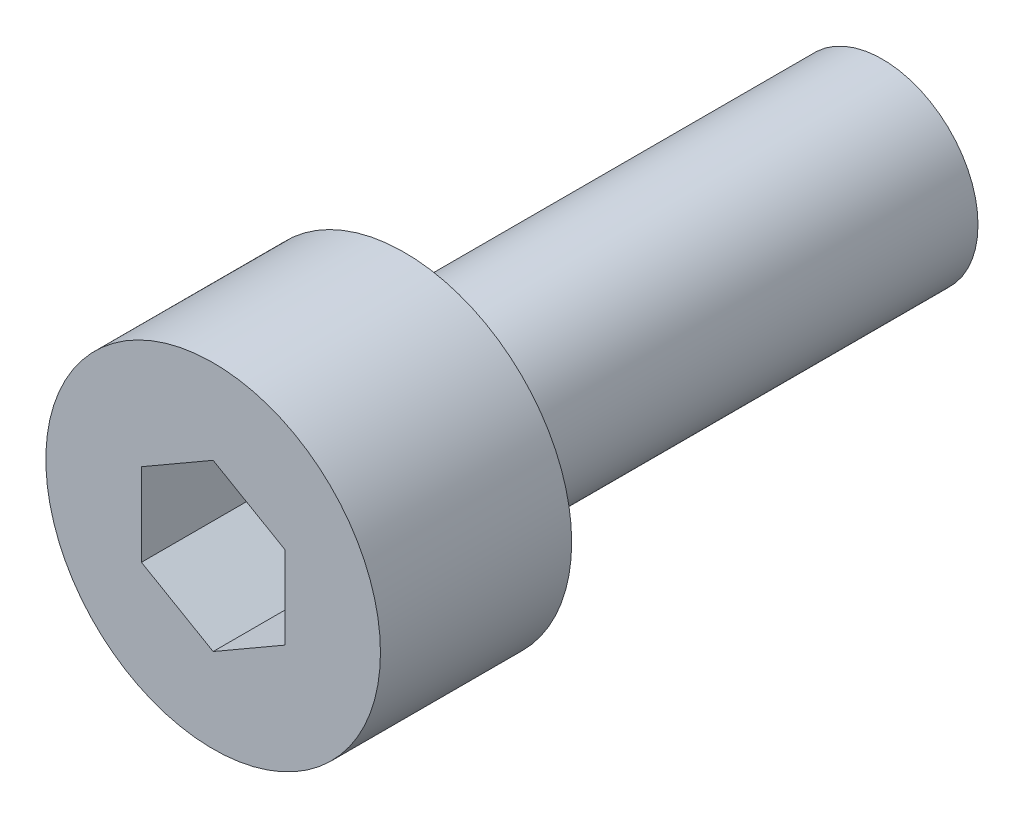
ISO-10303-21;
HEADER;
FILE_DESCRIPTION(('STEP AP214'),'2;1');
FILE_NAME('part.step','',(''),(''),'','','');
FILE_SCHEMA(('AUTOMOTIVE_DESIGN { 1 0 10303 214 1 1 1 1 }'));
ENDSEC;
DATA;
#1=APPLICATION_CONTEXT('core data for automotive mechanical design processes');
#2=APPLICATION_PROTOCOL_DEFINITION('international standard','automotive_design',2000,#1);
#3=PRODUCT_CONTEXT('',#1,'mechanical');
#4=PRODUCT('Part','Part','',(#3));
#5=PRODUCT_RELATED_PRODUCT_CATEGORY('part','',(#4));
#6=PRODUCT_DEFINITION_FORMATION('','',#4);
#7=PRODUCT_DEFINITION_CONTEXT('part definition',#1,'design');
#8=PRODUCT_DEFINITION('design','',#6,#7);
#9=PRODUCT_DEFINITION_SHAPE('','',#8);
#10=(LENGTH_UNIT() NAMED_UNIT(*) SI_UNIT(.MILLI.,.METRE.));
#11=(NAMED_UNIT(*) PLANE_ANGLE_UNIT() SI_UNIT($,.RADIAN.));
#12=(NAMED_UNIT(*) SI_UNIT($,.STERADIAN.) SOLID_ANGLE_UNIT());
#13=UNCERTAINTY_MEASURE_WITH_UNIT(LENGTH_MEASURE(1.E-05),#10,'distance_accuracy_value','');
#14=(GEOMETRIC_REPRESENTATION_CONTEXT(3) GLOBAL_UNCERTAINTY_ASSIGNED_CONTEXT((#13)) GLOBAL_UNIT_ASSIGNED_CONTEXT((#10,
#11,#12)) REPRESENTATION_CONTEXT('',''));
#15=CARTESIAN_POINT('',(0.,0.,0.));
#16=DIRECTION('',(0.,0.,1.));
#17=DIRECTION('',(1.,0.,0.));
#18=AXIS2_PLACEMENT_3D('',#15,#16,#17);
#19=CARTESIAN_POINT('',(0.,0.,0.));
#20=DIRECTION('',(0.,0.,-1.));
#21=DIRECTION('',(-1.,0.,0.));
#22=AXIS2_PLACEMENT_3D('',#19,#20,#21);
#23=CYLINDRICAL_SURFACE('',#22,2.);
#24=CARTESIAN_POINT('',(0.,0.,0.));
#25=DIRECTION('',(0.,0.,1.));
#26=DIRECTION('',(1.,0.,0.));
#27=AXIS2_PLACEMENT_3D('',#24,#25,#26);
#28=CIRCLE('',#27,2.);
#29=CARTESIAN_POINT('',(2.,0.,0.));
#30=VERTEX_POINT('',#29);
#31=EDGE_CURVE('E11',#30,#30,#28,.T.);
#32=ORIENTED_EDGE('',*,*,#31,.F.);
#33=EDGE_LOOP('',(#32));
#34=FACE_BOUND('',#33,.T.);
#35=CARTESIAN_POINT('',(0.,0.,-10.));
#36=DIRECTION('',(0.,0.,1.));
#37=DIRECTION('',(1.,0.,0.));
#38=AXIS2_PLACEMENT_3D('',#35,#36,#37);
#39=CIRCLE('',#38,2.);
#40=CARTESIAN_POINT('',(2.,0.,-10.));
#41=VERTEX_POINT('',#40);
#42=EDGE_CURVE('E46',#41,#41,#39,.T.);
#43=ORIENTED_EDGE('',*,*,#42,.T.);
#44=EDGE_LOOP('',(#43));
#45=FACE_BOUND('',#44,.T.);
#46=ADVANCED_FACE('F43',(#34,#45),#23,.T.);
#47=CARTESIAN_POINT('',(0.,0.,-10.));
#48=DIRECTION('',(0.,0.,1.));
#49=DIRECTION('',(1.,0.,0.));
#50=AXIS2_PLACEMENT_3D('',#47,#48,#49);
#51=PLANE('',#50);
#52=ORIENTED_EDGE('',*,*,#42,.F.);
#53=EDGE_LOOP('',(#52));
#54=FACE_BOUND('',#53,.T.);
#55=ADVANCED_FACE('F164',(#54),#51,.F.);
#56=CARTESIAN_POINT('',(0.,0.,4.));
#57=DIRECTION('',(0.,0.,1.));
#58=DIRECTION('',(1.,0.,0.));
#59=AXIS2_PLACEMENT_3D('',#56,#57,#58);
#60=PLANE('',#59);
#61=CARTESIAN_POINT('',(0.,0.,4.));
#62=DIRECTION('',(0.,0.,1.));
#63=DIRECTION('',(1.,0.,0.));
#64=AXIS2_PLACEMENT_3D('',#61,#62,#63);
#65=CIRCLE('',#64,3.5);
#66=CARTESIAN_POINT('',(3.5,0.,4.));
#67=VERTEX_POINT('',#66);
#68=EDGE_CURVE('E146',#67,#67,#65,.T.);
#69=ORIENTED_EDGE('',*,*,#68,.T.);
#70=EDGE_LOOP('',(#69));
#71=FACE_BOUND('',#70,.T.);
#72=DIRECTION('',(-0.866025403784439,0.5,0.));
#73=VECTOR('',#72,1.);
#74=CARTESIAN_POINT('',(1.5,0.866025403784439,4.));
#75=LINE('',#74,#73);
#76=CARTESIAN_POINT('',(1.5,0.866025403784439,4.));
#77=VERTEX_POINT('',#76);
#78=CARTESIAN_POINT('',(0.,1.73205080756888,4.));
#79=VERTEX_POINT('',#78);
#80=EDGE_CURVE('E103',#77,#79,#75,.T.);
#81=ORIENTED_EDGE('',*,*,#80,.F.);
#82=DIRECTION('',(0.,1.,0.));
#83=VECTOR('',#82,1.);
#84=CARTESIAN_POINT('',(1.5,-0.866025403784439,4.));
#85=LINE('',#84,#83);
#86=CARTESIAN_POINT('',(1.5,-0.866025403784439,4.));
#87=VERTEX_POINT('',#86);
#88=EDGE_CURVE('E94',#87,#77,#85,.T.);
#89=ORIENTED_EDGE('',*,*,#88,.F.);
#90=DIRECTION('',(0.866025403784439,0.5,0.));
#91=VECTOR('',#90,1.);
#92=CARTESIAN_POINT('',(0.,-1.73205080756888,4.));
#93=LINE('',#92,#91);
#94=CARTESIAN_POINT('',(0.,-1.73205080756888,4.));
#95=VERTEX_POINT('',#94);
#96=EDGE_CURVE('E124',#95,#87,#93,.T.);
#97=ORIENTED_EDGE('',*,*,#96,.F.);
#98=DIRECTION('',(0.866025403784439,-0.5,0.));
#99=VECTOR('',#98,1.);
#100=CARTESIAN_POINT('',(-1.5,-0.866025403784439,4.));
#101=LINE('',#100,#99);
#102=CARTESIAN_POINT('',(-1.5,-0.866025403784439,4.));
#103=VERTEX_POINT('',#102);
#104=EDGE_CURVE('E121',#103,#95,#101,.T.);
#105=ORIENTED_EDGE('',*,*,#104,.F.);
#106=DIRECTION('',(0.,-1.,0.));
#107=VECTOR('',#106,1.);
#108=CARTESIAN_POINT('',(-1.5,0.866025403784439,4.));
#109=LINE('',#108,#107);
#110=CARTESIAN_POINT('',(-1.5,0.866025403784439,4.));
#111=VERTEX_POINT('',#110);
#112=EDGE_CURVE('E117',#111,#103,#109,.T.);
#113=ORIENTED_EDGE('',*,*,#112,.F.);
#114=DIRECTION('',(-0.866025403784439,-0.5,0.));
#115=VECTOR('',#114,1.);
#116=CARTESIAN_POINT('',(0.,1.73205080756888,4.));
#117=LINE('',#116,#115);
#118=EDGE_CURVE('E115',#79,#111,#117,.T.);
#119=ORIENTED_EDGE('',*,*,#118,.F.);
#120=EDGE_LOOP('',(#81,#89,#97,#105,#113,#119));
#121=FACE_BOUND('',#120,.T.);
#122=ADVANCED_FACE('F113',(#71,#121),#60,.T.);
#123=CARTESIAN_POINT('',(0.,0.,0.));
#124=DIRECTION('',(0.,0.,1.));
#125=DIRECTION('',(1.,0.,0.));
#126=AXIS2_PLACEMENT_3D('',#123,#124,#125);
#127=PLANE('',#126);
#128=ORIENTED_EDGE('',*,*,#31,.T.);
#129=EDGE_LOOP('',(#128));
#130=FACE_BOUND('',#129,.T.);
#131=CARTESIAN_POINT('',(0.,0.,0.));
#132=DIRECTION('',(0.,0.,1.));
#133=DIRECTION('',(1.,0.,0.));
#134=AXIS2_PLACEMENT_3D('',#131,#132,#133);
#135=CIRCLE('',#134,3.5);
#136=CARTESIAN_POINT('',(3.5,0.,0.));
#137=VERTEX_POINT('',#136);
#138=EDGE_CURVE('E109',#137,#137,#135,.T.);
#139=ORIENTED_EDGE('',*,*,#138,.F.);
#140=EDGE_LOOP('',(#139));
#141=FACE_BOUND('',#140,.T.);
#142=ADVANCED_FACE('F154',(#130,#141),#127,.F.);
#143=CARTESIAN_POINT('',(0.,0.,4.));
#144=DIRECTION('',(0.,0.,-1.));
#145=DIRECTION('',(-1.,0.,0.));
#146=AXIS2_PLACEMENT_3D('',#143,#144,#145);
#147=CYLINDRICAL_SURFACE('',#146,3.5);
#148=ORIENTED_EDGE('',*,*,#68,.F.);
#149=EDGE_LOOP('',(#148));
#150=FACE_BOUND('',#149,.T.);
#151=ORIENTED_EDGE('',*,*,#138,.T.);
#152=EDGE_LOOP('',(#151));
#153=FACE_BOUND('',#152,.T.);
#154=ADVANCED_FACE('F152',(#150,#153),#147,.T.);
#155=CARTESIAN_POINT('',(1.5,-0.866025403784439,4.));
#156=DIRECTION('',(-1.,0.,0.));
#157=DIRECTION('',(0.,-1.,0.));
#158=AXIS2_PLACEMENT_3D('',#155,#156,#157);
#159=PLANE('',#158);
#160=DIRECTION('',(0.,1.,0.));
#161=VECTOR('',#160,1.);
#162=CARTESIAN_POINT('',(1.5,-0.866025403784439,0.));
#163=LINE('',#162,#161);
#164=CARTESIAN_POINT('',(1.5,-0.866025403784439,0.));
#165=VERTEX_POINT('',#164);
#166=CARTESIAN_POINT('',(1.5,0.866025403784439,0.));
#167=VERTEX_POINT('',#166);
#168=EDGE_CURVE('E57',#165,#167,#163,.T.);
#169=ORIENTED_EDGE('',*,*,#168,.F.);
#170=DIRECTION('',(0.,0.,-1.));
#171=VECTOR('',#170,1.);
#172=CARTESIAN_POINT('',(1.5,-0.866025403784439,4.));
#173=LINE('',#172,#171);
#174=EDGE_CURVE('E99',#87,#165,#173,.T.);
#175=ORIENTED_EDGE('',*,*,#174,.F.);
#176=ORIENTED_EDGE('',*,*,#88,.T.);
#177=DIRECTION('',(0.,0.,-1.));
#178=VECTOR('',#177,1.);
#179=CARTESIAN_POINT('',(1.5,0.866025403784439,4.));
#180=LINE('',#179,#178);
#181=EDGE_CURVE('E97',#77,#167,#180,.T.);
#182=ORIENTED_EDGE('',*,*,#181,.T.);
#183=EDGE_LOOP('',(#169,#175,#176,#182));
#184=FACE_BOUND('',#183,.T.);
#185=ADVANCED_FACE('F96',(#184),#159,.T.);
#186=CARTESIAN_POINT('',(1.5,0.866025403784439,4.));
#187=DIRECTION('',(-0.5,-0.866025403784439,0.));
#188=DIRECTION('',(0.866025403784439,-0.5,0.));
#189=AXIS2_PLACEMENT_3D('',#186,#187,#188);
#190=PLANE('',#189);
#191=DIRECTION('',(-0.866025403784439,0.5,0.));
#192=VECTOR('',#191,1.);
#193=CARTESIAN_POINT('',(1.5,0.866025403784439,0.));
#194=LINE('',#193,#192);
#195=CARTESIAN_POINT('',(0.,1.73205080756888,0.));
#196=VERTEX_POINT('',#195);
#197=EDGE_CURVE('E61',#167,#196,#194,.T.);
#198=ORIENTED_EDGE('',*,*,#197,.F.);
#199=ORIENTED_EDGE('',*,*,#181,.F.);
#200=ORIENTED_EDGE('',*,*,#80,.T.);
#201=DIRECTION('',(0.,0.,-1.));
#202=VECTOR('',#201,1.);
#203=CARTESIAN_POINT('',(0.,1.73205080756888,4.));
#204=LINE('',#203,#202);
#205=EDGE_CURVE('E110',#79,#196,#204,.T.);
#206=ORIENTED_EDGE('',*,*,#205,.T.);
#207=EDGE_LOOP('',(#198,#199,#200,#206));
#208=FACE_BOUND('',#207,.T.);
#209=ADVANCED_FACE('F107',(#208),#190,.T.);
#210=CARTESIAN_POINT('',(0.,1.73205080756888,4.));
#211=DIRECTION('',(0.5,-0.866025403784439,0.));
#212=DIRECTION('',(0.866025403784439,0.5,0.));
#213=AXIS2_PLACEMENT_3D('',#210,#211,#212);
#214=PLANE('',#213);
#215=DIRECTION('',(-0.866025403784439,-0.5,0.));
#216=VECTOR('',#215,1.);
#217=CARTESIAN_POINT('',(0.,1.73205080756888,0.));
#218=LINE('',#217,#216);
#219=CARTESIAN_POINT('',(-1.5,0.866025403784439,0.));
#220=VERTEX_POINT('',#219);
#221=EDGE_CURVE('E128',#196,#220,#218,.T.);
#222=ORIENTED_EDGE('',*,*,#221,.F.);
#223=ORIENTED_EDGE('',*,*,#205,.F.);
#224=ORIENTED_EDGE('',*,*,#118,.T.);
#225=DIRECTION('',(0.,0.,-1.));
#226=VECTOR('',#225,1.);
#227=CARTESIAN_POINT('',(-1.5,0.866025403784439,4.));
#228=LINE('',#227,#226);
#229=EDGE_CURVE('E142',#111,#220,#228,.T.);
#230=ORIENTED_EDGE('',*,*,#229,.T.);
#231=EDGE_LOOP('',(#222,#223,#224,#230));
#232=FACE_BOUND('',#231,.T.);
#233=ADVANCED_FACE('F199',(#232),#214,.T.);
#234=CARTESIAN_POINT('',(-1.5,0.866025403784439,4.));
#235=DIRECTION('',(1.,0.,0.));
#236=DIRECTION('',(0.,1.,0.));
#237=AXIS2_PLACEMENT_3D('',#234,#235,#236);
#238=PLANE('',#237);
#239=DIRECTION('',(0.,-1.,0.));
#240=VECTOR('',#239,1.);
#241=CARTESIAN_POINT('',(-1.5,0.866025403784439,0.));
#242=LINE('',#241,#240);
#243=CARTESIAN_POINT('',(-1.5,-0.866025403784439,0.));
#244=VERTEX_POINT('',#243);
#245=EDGE_CURVE('E130',#220,#244,#242,.T.);
#246=ORIENTED_EDGE('',*,*,#245,.F.);
#247=ORIENTED_EDGE('',*,*,#229,.F.);
#248=ORIENTED_EDGE('',*,*,#112,.T.);
#249=DIRECTION('',(0.,0.,-1.));
#250=VECTOR('',#249,1.);
#251=CARTESIAN_POINT('',(-1.5,-0.866025403784439,4.));
#252=LINE('',#251,#250);
#253=EDGE_CURVE('E139',#103,#244,#252,.T.);
#254=ORIENTED_EDGE('',*,*,#253,.T.);
#255=EDGE_LOOP('',(#246,#247,#248,#254));
#256=FACE_BOUND('',#255,.T.);
#257=ADVANCED_FACE('F192',(#256),#238,.T.);
#258=CARTESIAN_POINT('',(-1.5,-0.866025403784439,4.));
#259=DIRECTION('',(0.5,0.866025403784439,0.));
#260=DIRECTION('',(-0.866025403784439,0.5,0.));
#261=AXIS2_PLACEMENT_3D('',#258,#259,#260);
#262=PLANE('',#261);
#263=DIRECTION('',(0.866025403784439,-0.5,0.));
#264=VECTOR('',#263,1.);
#265=CARTESIAN_POINT('',(-1.5,-0.866025403784439,0.));
#266=LINE('',#265,#264);
#267=CARTESIAN_POINT('',(0.,-1.73205080756888,0.));
#268=VERTEX_POINT('',#267);
#269=EDGE_CURVE('E132',#244,#268,#266,.T.);
#270=ORIENTED_EDGE('',*,*,#269,.F.);
#271=ORIENTED_EDGE('',*,*,#253,.F.);
#272=ORIENTED_EDGE('',*,*,#104,.T.);
#273=DIRECTION('',(0.,0.,-1.));
#274=VECTOR('',#273,1.);
#275=CARTESIAN_POINT('',(0.,-1.73205080756888,4.));
#276=LINE('',#275,#274);
#277=EDGE_CURVE('E136',#95,#268,#276,.T.);
#278=ORIENTED_EDGE('',*,*,#277,.T.);
#279=EDGE_LOOP('',(#270,#271,#272,#278));
#280=FACE_BOUND('',#279,.T.);
#281=ADVANCED_FACE('F186',(#280),#262,.T.);
#282=CARTESIAN_POINT('',(0.,-1.73205080756888,4.));
#283=DIRECTION('',(-0.5,0.866025403784439,0.));
#284=DIRECTION('',(-0.866025403784439,-0.5,0.));
#285=AXIS2_PLACEMENT_3D('',#282,#283,#284);
#286=PLANE('',#285);
#287=DIRECTION('',(0.866025403784439,0.5,0.));
#288=VECTOR('',#287,1.);
#289=CARTESIAN_POINT('',(0.,-1.73205080756888,0.));
#290=LINE('',#289,#288);
#291=EDGE_CURVE('E104',#268,#165,#290,.T.);
#292=ORIENTED_EDGE('',*,*,#291,.F.);
#293=ORIENTED_EDGE('',*,*,#277,.F.);
#294=ORIENTED_EDGE('',*,*,#96,.T.);
#295=ORIENTED_EDGE('',*,*,#174,.T.);
#296=EDGE_LOOP('',(#292,#293,#294,#295));
#297=FACE_BOUND('',#296,.T.);
#298=ADVANCED_FACE('F182',(#297),#286,.T.);
#299=CARTESIAN_POINT('',(0.,0.,0.));
#300=DIRECTION('',(0.,0.,1.));
#301=DIRECTION('',(1.,0.,0.));
#302=AXIS2_PLACEMENT_3D('',#299,#300,#301);
#303=PLANE('',#302);
#304=ORIENTED_EDGE('',*,*,#168,.T.);
#305=ORIENTED_EDGE('',*,*,#197,.T.);
#306=ORIENTED_EDGE('',*,*,#221,.T.);
#307=ORIENTED_EDGE('',*,*,#245,.T.);
#308=ORIENTED_EDGE('',*,*,#269,.T.);
#309=ORIENTED_EDGE('',*,*,#291,.T.);
#310=EDGE_LOOP('',(#304,#305,#306,#307,#308,#309));
#311=FACE_BOUND('',#310,.T.);
#312=ADVANCED_FACE('F180',(#311),#303,.T.);
#313=CLOSED_SHELL('',(#46,#55,#122,#142,#154,#185,#209,#233,#257,#281,#298,#312));
#314=MANIFOLD_SOLID_BREP('B2',#313);
#315=ADVANCED_BREP_SHAPE_REPRESENTATION('',(#18,#314),#14);
#316=SHAPE_DEFINITION_REPRESENTATION(#9,#315);
ENDSEC;
END-ISO-10303-21;
